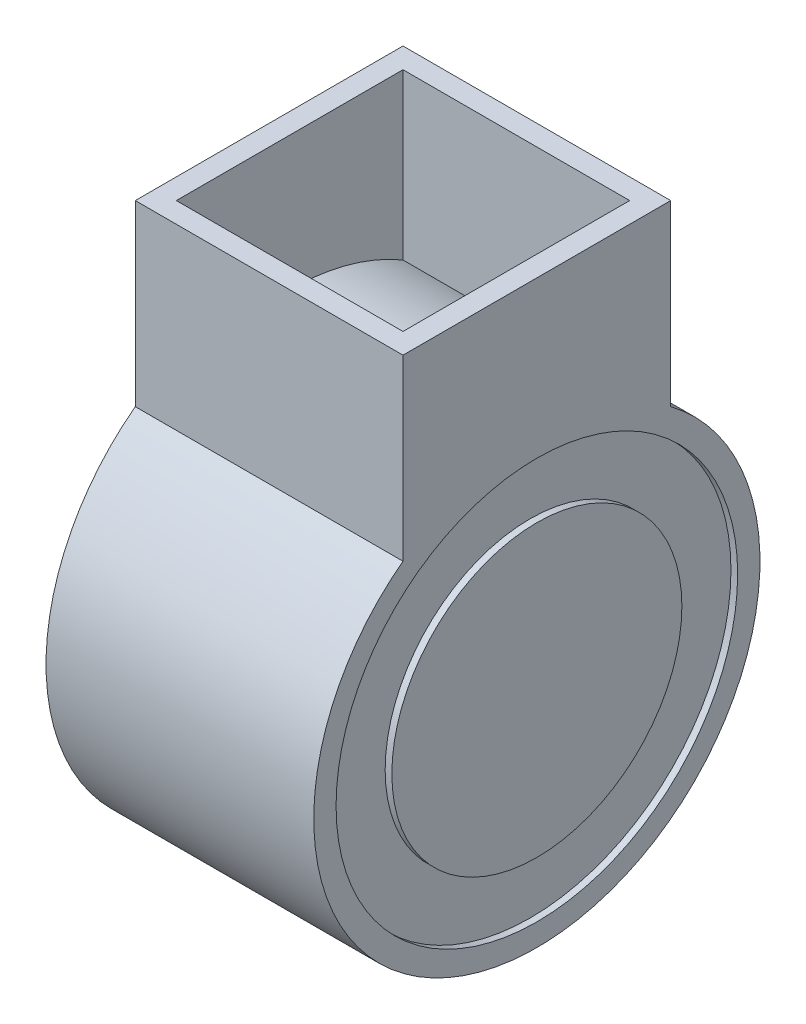
ISO-10303-21;
HEADER;
FILE_DESCRIPTION(('STEP AP214'),'2;1');
FILE_NAME('part.step','',(''),(''),'','','');
FILE_SCHEMA(('AUTOMOTIVE_DESIGN { 1 0 10303 214 1 1 1 1 }'));
ENDSEC;
DATA;
#1=APPLICATION_CONTEXT('core data for automotive mechanical design processes');
#2=APPLICATION_PROTOCOL_DEFINITION('international standard','automotive_design',2000,#1);
#3=PRODUCT_CONTEXT('',#1,'mechanical');
#4=PRODUCT('Part','Part','',(#3));
#5=PRODUCT_RELATED_PRODUCT_CATEGORY('part','',(#4));
#6=PRODUCT_DEFINITION_FORMATION('','',#4);
#7=PRODUCT_DEFINITION_CONTEXT('part definition',#1,'design');
#8=PRODUCT_DEFINITION('design','',#6,#7);
#9=PRODUCT_DEFINITION_SHAPE('','',#8);
#10=(LENGTH_UNIT() NAMED_UNIT(*) SI_UNIT(.MILLI.,.METRE.));
#11=(NAMED_UNIT(*) PLANE_ANGLE_UNIT() SI_UNIT($,.RADIAN.));
#12=(NAMED_UNIT(*) SI_UNIT($,.STERADIAN.) SOLID_ANGLE_UNIT());
#13=UNCERTAINTY_MEASURE_WITH_UNIT(LENGTH_MEASURE(1.E-05),#10,'distance_accuracy_value','');
#14=(GEOMETRIC_REPRESENTATION_CONTEXT(3) GLOBAL_UNCERTAINTY_ASSIGNED_CONTEXT((#13)) GLOBAL_UNIT_ASSIGNED_CONTEXT((#10,
#11,#12)) REPRESENTATION_CONTEXT('',''));
#15=CARTESIAN_POINT('',(0.,0.,0.));
#16=DIRECTION('',(0.,0.,1.));
#17=DIRECTION('',(1.,0.,0.));
#18=AXIS2_PLACEMENT_3D('',#15,#16,#17);
#19=CARTESIAN_POINT('',(30.,0.,0.));
#20=DIRECTION('',(-1.,0.,0.));
#21=DIRECTION('',(0.,0.,1.));
#22=AXIS2_PLACEMENT_3D('',#19,#20,#21);
#23=CYLINDRICAL_SURFACE('',#22,50.);
#24=DIRECTION('',(-1.,0.,0.));
#25=VECTOR('',#24,1.);
#26=CARTESIAN_POINT('',(30.,43.0678534408206,25.4));
#27=LINE('',#26,#25);
#28=CARTESIAN_POINT('',(-25.4,43.0678534408206,25.4));
#29=VERTEX_POINT('',#28);
#30=CARTESIAN_POINT('',(25.4,43.0678534408206,25.4));
#31=VERTEX_POINT('',#30);
#32=EDGE_CURVE('E78',#29,#31,#27,.F.);
#33=ORIENTED_EDGE('',*,*,#32,.T.);
#34=CARTESIAN_POINT('',(25.4,0.,0.));
#35=DIRECTION('',(1.,0.,0.));
#36=DIRECTION('',(0.,0.,-1.));
#37=AXIS2_PLACEMENT_3D('',#34,#35,#36);
#38=CIRCLE('',#37,50.);
#39=CARTESIAN_POINT('',(25.4,43.0678534408206,-25.4));
#40=VERTEX_POINT('',#39);
#41=EDGE_CURVE('E171',#31,#40,#38,.F.);
#42=ORIENTED_EDGE('',*,*,#41,.T.);
#43=DIRECTION('',(-1.,0.,0.));
#44=VECTOR('',#43,1.);
#45=CARTESIAN_POINT('',(30.,43.0678534408206,-25.4));
#46=LINE('',#45,#44);
#47=CARTESIAN_POINT('',(-25.4,43.0678534408206,-25.4));
#48=VERTEX_POINT('',#47);
#49=EDGE_CURVE('E167',#40,#48,#46,.T.);
#50=ORIENTED_EDGE('',*,*,#49,.T.);
#51=CARTESIAN_POINT('',(-25.4,0.,0.));
#52=DIRECTION('',(-1.,0.,0.));
#53=DIRECTION('',(0.,0.,1.));
#54=AXIS2_PLACEMENT_3D('',#51,#52,#53);
#55=CIRCLE('',#54,50.);
#56=EDGE_CURVE('E74',#48,#29,#55,.F.);
#57=ORIENTED_EDGE('',*,*,#56,.T.);
#58=EDGE_LOOP('',(#33,#42,#50,#57));
#59=FACE_BOUND('',#58,.T.);
#60=ADVANCED_FACE('F59',(#59),#23,.T.);
#61=CARTESIAN_POINT('',(-25.4,-50.002,25.4));
#62=DIRECTION('',(0.,0.,1.));
#63=DIRECTION('',(1.,0.,0.));
#64=AXIS2_PLACEMENT_3D('',#61,#62,#63);
#65=PLANE('',#64);
#66=ORIENTED_EDGE('',*,*,#32,.F.);
#67=DIRECTION('',(0.,1.,0.));
#68=VECTOR('',#67,1.);
#69=CARTESIAN_POINT('',(-25.4,-50.002,25.4));
#70=LINE('',#69,#68);
#71=CARTESIAN_POINT('',(-25.4,80.,25.4));
#72=VERTEX_POINT('',#71);
#73=EDGE_CURVE('E157',#29,#72,#70,.T.);
#74=ORIENTED_EDGE('',*,*,#73,.T.);
#75=DIRECTION('',(1.,0.,0.));
#76=VECTOR('',#75,1.);
#77=CARTESIAN_POINT('',(-25.4,80.,25.4));
#78=LINE('',#77,#76);
#79=CARTESIAN_POINT('',(25.4,80.,25.4));
#80=VERTEX_POINT('',#79);
#81=EDGE_CURVE('E278',#72,#80,#78,.T.);
#82=ORIENTED_EDGE('',*,*,#81,.T.);
#83=DIRECTION('',(0.,1.,0.));
#84=VECTOR('',#83,1.);
#85=CARTESIAN_POINT('',(25.4,-50.002,25.4));
#86=LINE('',#85,#84);
#87=EDGE_CURVE('E158',#31,#80,#86,.T.);
#88=ORIENTED_EDGE('',*,*,#87,.F.);
#89=EDGE_LOOP('',(#66,#74,#82,#88));
#90=FACE_BOUND('',#89,.T.);
#91=ADVANCED_FACE('F194',(#90),#65,.F.);
#92=CARTESIAN_POINT('',(-30.,-50.002,-30.));
#93=DIRECTION('',(0.,0.,-1.));
#94=DIRECTION('',(-1.,0.,0.));
#95=AXIS2_PLACEMENT_3D('',#92,#93,#94);
#96=PLANE('',#95);
#97=DIRECTION('',(0.,1.,0.));
#98=VECTOR('',#97,1.);
#99=CARTESIAN_POINT('',(30.,-50.002,-30.));
#100=LINE('',#99,#98);
#101=CARTESIAN_POINT('',(30.,40.,-30.));
#102=VERTEX_POINT('',#101);
#103=CARTESIAN_POINT('',(30.,80.,-30.));
#104=VERTEX_POINT('',#103);
#105=EDGE_CURVE('E132',#102,#104,#100,.T.);
#106=ORIENTED_EDGE('',*,*,#105,.F.);
#107=DIRECTION('',(-1.,0.,0.));
#108=VECTOR('',#107,1.);
#109=CARTESIAN_POINT('',(30.,40.,-30.));
#110=LINE('',#109,#108);
#111=CARTESIAN_POINT('',(-30.,40.,-30.));
#112=VERTEX_POINT('',#111);
#113=EDGE_CURVE('E130',#102,#112,#110,.T.);
#114=ORIENTED_EDGE('',*,*,#113,.T.);
#115=DIRECTION('',(0.,1.,0.));
#116=VECTOR('',#115,1.);
#117=CARTESIAN_POINT('',(-30.,-50.002,-30.));
#118=LINE('',#117,#116);
#119=CARTESIAN_POINT('',(-30.,80.,-30.));
#120=VERTEX_POINT('',#119);
#121=EDGE_CURVE('E123',#112,#120,#118,.T.);
#122=ORIENTED_EDGE('',*,*,#121,.T.);
#123=DIRECTION('',(-1.,0.,0.));
#124=VECTOR('',#123,1.);
#125=CARTESIAN_POINT('',(-30.,80.,-30.));
#126=LINE('',#125,#124);
#127=EDGE_CURVE('E128',#104,#120,#126,.T.);
#128=ORIENTED_EDGE('',*,*,#127,.F.);
#129=EDGE_LOOP('',(#106,#114,#122,#128));
#130=FACE_BOUND('',#129,.T.);
#131=ADVANCED_FACE('F126',(#130),#96,.T.);
#132=CARTESIAN_POINT('',(-25.4,-50.002,25.4));
#133=DIRECTION('',(-1.,0.,0.));
#134=DIRECTION('',(0.,0.,1.));
#135=AXIS2_PLACEMENT_3D('',#132,#133,#134);
#136=PLANE('',#135);
#137=ORIENTED_EDGE('',*,*,#56,.F.);
#138=DIRECTION('',(0.,1.,0.));
#139=VECTOR('',#138,1.);
#140=CARTESIAN_POINT('',(-25.4,-50.002,-25.4));
#141=LINE('',#140,#139);
#142=CARTESIAN_POINT('',(-25.4,80.,-25.4));
#143=VERTEX_POINT('',#142);
#144=EDGE_CURVE('E155',#48,#143,#141,.T.);
#145=ORIENTED_EDGE('',*,*,#144,.T.);
#146=DIRECTION('',(0.,0.,1.));
#147=VECTOR('',#146,1.);
#148=CARTESIAN_POINT('',(-25.4,80.,25.4));
#149=LINE('',#148,#147);
#150=EDGE_CURVE('E281',#143,#72,#149,.T.);
#151=ORIENTED_EDGE('',*,*,#150,.T.);
#152=ORIENTED_EDGE('',*,*,#73,.F.);
#153=EDGE_LOOP('',(#137,#145,#151,#152));
#154=FACE_BOUND('',#153,.T.);
#155=ADVANCED_FACE('F216',(#154),#136,.F.);
#156=CARTESIAN_POINT('',(0.,80.,0.));
#157=DIRECTION('',(0.,-1.,0.));
#158=DIRECTION('',(0.,0.,-1.));
#159=AXIS2_PLACEMENT_3D('',#156,#157,#158);
#160=PLANE('',#159);
#161=DIRECTION('',(0.,0.,-1.));
#162=VECTOR('',#161,1.);
#163=CARTESIAN_POINT('',(30.,80.,30.));
#164=LINE('',#163,#162);
#165=CARTESIAN_POINT('',(30.,80.,30.));
#166=VERTEX_POINT('',#165);
#167=EDGE_CURVE('E147',#166,#104,#164,.T.);
#168=ORIENTED_EDGE('',*,*,#167,.T.);
#169=ORIENTED_EDGE('',*,*,#127,.T.);
#170=DIRECTION('',(0.,0.,1.));
#171=VECTOR('',#170,1.);
#172=CARTESIAN_POINT('',(-30.,80.,30.));
#173=LINE('',#172,#171);
#174=CARTESIAN_POINT('',(-30.,80.,30.));
#175=VERTEX_POINT('',#174);
#176=EDGE_CURVE('E136',#120,#175,#173,.T.);
#177=ORIENTED_EDGE('',*,*,#176,.T.);
#178=DIRECTION('',(1.,0.,0.));
#179=VECTOR('',#178,1.);
#180=CARTESIAN_POINT('',(-30.,80.,30.));
#181=LINE('',#180,#179);
#182=EDGE_CURVE('E142',#175,#166,#181,.T.);
#183=ORIENTED_EDGE('',*,*,#182,.T.);
#184=EDGE_LOOP('',(#168,#169,#177,#183));
#185=FACE_BOUND('',#184,.T.);
#186=DIRECTION('',(0.,0.,-1.));
#187=VECTOR('',#186,1.);
#188=CARTESIAN_POINT('',(25.4,80.,25.4));
#189=LINE('',#188,#187);
#190=CARTESIAN_POINT('',(25.4,80.,-25.4));
#191=VERTEX_POINT('',#190);
#192=EDGE_CURVE('E164',#80,#191,#189,.T.);
#193=ORIENTED_EDGE('',*,*,#192,.F.);
#194=ORIENTED_EDGE('',*,*,#81,.F.);
#195=ORIENTED_EDGE('',*,*,#150,.F.);
#196=DIRECTION('',(-1.,0.,0.));
#197=VECTOR('',#196,1.);
#198=CARTESIAN_POINT('',(-25.4,80.,-25.4));
#199=LINE('',#198,#197);
#200=EDGE_CURVE('E284',#191,#143,#199,.T.);
#201=ORIENTED_EDGE('',*,*,#200,.F.);
#202=EDGE_LOOP('',(#193,#194,#195,#201));
#203=FACE_BOUND('',#202,.T.);
#204=ADVANCED_FACE('F144',(#185,#203),#160,.F.);
#205=CARTESIAN_POINT('',(25.4,-50.002,25.4));
#206=DIRECTION('',(1.,0.,0.));
#207=DIRECTION('',(0.,0.,-1.));
#208=AXIS2_PLACEMENT_3D('',#205,#206,#207);
#209=PLANE('',#208);
#210=ORIENTED_EDGE('',*,*,#41,.F.);
#211=ORIENTED_EDGE('',*,*,#87,.T.);
#212=ORIENTED_EDGE('',*,*,#192,.T.);
#213=DIRECTION('',(0.,1.,0.));
#214=VECTOR('',#213,1.);
#215=CARTESIAN_POINT('',(25.4,-50.002,-25.4));
#216=LINE('',#215,#214);
#217=EDGE_CURVE('E153',#40,#191,#216,.T.);
#218=ORIENTED_EDGE('',*,*,#217,.F.);
#219=EDGE_LOOP('',(#210,#211,#212,#218));
#220=FACE_BOUND('',#219,.T.);
#221=ADVANCED_FACE('F210',(#220),#209,.F.);
#222=CARTESIAN_POINT('',(-25.4,-50.002,-25.4));
#223=DIRECTION('',(0.,0.,-1.));
#224=DIRECTION('',(-1.,0.,0.));
#225=AXIS2_PLACEMENT_3D('',#222,#223,#224);
#226=PLANE('',#225);
#227=ORIENTED_EDGE('',*,*,#49,.F.);
#228=ORIENTED_EDGE('',*,*,#217,.T.);
#229=ORIENTED_EDGE('',*,*,#200,.T.);
#230=ORIENTED_EDGE('',*,*,#144,.F.);
#231=EDGE_LOOP('',(#227,#228,#229,#230));
#232=FACE_BOUND('',#231,.T.);
#233=ADVANCED_FACE('F201',(#232),#226,.F.);
#234=CARTESIAN_POINT('',(-30.,-50.002,30.));
#235=DIRECTION('',(0.,0.,1.));
#236=DIRECTION('',(1.,0.,0.));
#237=AXIS2_PLACEMENT_3D('',#234,#235,#236);
#238=PLANE('',#237);
#239=DIRECTION('',(0.,1.,0.));
#240=VECTOR('',#239,1.);
#241=CARTESIAN_POINT('',(-30.,-50.002,30.));
#242=LINE('',#241,#240);
#243=CARTESIAN_POINT('',(-30.,40.,30.));
#244=VERTEX_POINT('',#243);
#245=EDGE_CURVE('E133',#244,#175,#242,.T.);
#246=ORIENTED_EDGE('',*,*,#245,.F.);
#247=DIRECTION('',(-1.,0.,0.));
#248=VECTOR('',#247,1.);
#249=CARTESIAN_POINT('',(30.,40.,30.));
#250=LINE('',#249,#248);
#251=CARTESIAN_POINT('',(30.,40.,30.));
#252=VERTEX_POINT('',#251);
#253=EDGE_CURVE('E160',#244,#252,#250,.F.);
#254=ORIENTED_EDGE('',*,*,#253,.T.);
#255=DIRECTION('',(0.,1.,0.));
#256=VECTOR('',#255,1.);
#257=CARTESIAN_POINT('',(30.,-50.002,30.));
#258=LINE('',#257,#256);
#259=EDGE_CURVE('E162',#252,#166,#258,.T.);
#260=ORIENTED_EDGE('',*,*,#259,.T.);
#261=ORIENTED_EDGE('',*,*,#182,.F.);
#262=EDGE_LOOP('',(#246,#254,#260,#261));
#263=FACE_BOUND('',#262,.T.);
#264=ADVANCED_FACE('F178',(#263),#238,.T.);
#265=CARTESIAN_POINT('',(30.,0.,0.));
#266=DIRECTION('',(1.,0.,0.));
#267=DIRECTION('',(0.,0.,-1.));
#268=AXIS2_PLACEMENT_3D('',#265,#266,#267);
#269=PLANE('',#268);
#270=CARTESIAN_POINT('',(30.,0.,0.));
#271=DIRECTION('',(1.,0.,0.));
#272=DIRECTION('',(0.,0.,-1.));
#273=AXIS2_PLACEMENT_3D('',#270,#271,#272);
#274=CIRCLE('',#273,45.);
#275=CARTESIAN_POINT('',(30.,0.,-45.));
#276=VERTEX_POINT('',#275);
#277=EDGE_CURVE('E271',#276,#276,#274,.T.);
#278=ORIENTED_EDGE('',*,*,#277,.F.);
#279=EDGE_LOOP('',(#278));
#280=FACE_BOUND('',#279,.T.);
#281=CARTESIAN_POINT('',(30.,0.,0.));
#282=DIRECTION('',(1.,0.,0.));
#283=DIRECTION('',(0.,0.,-1.));
#284=AXIS2_PLACEMENT_3D('',#281,#282,#283);
#285=CIRCLE('',#284,50.);
#286=EDGE_CURVE('E12',#252,#102,#285,.T.);
#287=ORIENTED_EDGE('',*,*,#286,.T.);
#288=ORIENTED_EDGE('',*,*,#105,.T.);
#289=ORIENTED_EDGE('',*,*,#167,.F.);
#290=ORIENTED_EDGE('',*,*,#259,.F.);
#291=EDGE_LOOP('',(#287,#288,#289,#290));
#292=FACE_BOUND('',#291,.T.);
#293=ADVANCED_FACE('F181',(#280,#292),#269,.T.);
#294=CARTESIAN_POINT('',(-30.,0.,0.));
#295=DIRECTION('',(1.,0.,0.));
#296=DIRECTION('',(0.,0.,-1.));
#297=AXIS2_PLACEMENT_3D('',#294,#295,#296);
#298=PLANE('',#297);
#299=CARTESIAN_POINT('',(-30.,0.,0.));
#300=DIRECTION('',(1.,0.,0.));
#301=DIRECTION('',(0.,0.,-1.));
#302=AXIS2_PLACEMENT_3D('',#299,#300,#301);
#303=CIRCLE('',#302,45.);
#304=CARTESIAN_POINT('',(-30.,0.,-45.));
#305=VERTEX_POINT('',#304);
#306=EDGE_CURVE('E259',#305,#305,#303,.T.);
#307=ORIENTED_EDGE('',*,*,#306,.T.);
#308=EDGE_LOOP('',(#307));
#309=FACE_BOUND('',#308,.T.);
#310=CARTESIAN_POINT('',(-30.,0.,0.));
#311=DIRECTION('',(1.,0.,0.));
#312=DIRECTION('',(0.,0.,-1.));
#313=AXIS2_PLACEMENT_3D('',#310,#311,#312);
#314=CIRCLE('',#313,50.);
#315=EDGE_CURVE('E63',#244,#112,#314,.T.);
#316=ORIENTED_EDGE('',*,*,#315,.F.);
#317=ORIENTED_EDGE('',*,*,#245,.T.);
#318=ORIENTED_EDGE('',*,*,#176,.F.);
#319=ORIENTED_EDGE('',*,*,#121,.F.);
#320=EDGE_LOOP('',(#316,#317,#318,#319));
#321=FACE_BOUND('',#320,.T.);
#322=ADVANCED_FACE('F137',(#309,#321),#298,.F.);
#323=ORIENTED_EDGE('',*,*,#315,.T.);
#324=ORIENTED_EDGE('',*,*,#113,.F.);
#325=ORIENTED_EDGE('',*,*,#286,.F.);
#326=ORIENTED_EDGE('',*,*,#253,.F.);
#327=EDGE_LOOP('',(#323,#324,#325,#326));
#328=FACE_BOUND('',#327,.T.);
#329=ADVANCED_FACE('F61',(#328),#23,.T.);
#330=CARTESIAN_POINT('',(28.5,0.,0.));
#331=DIRECTION('',(1.,0.,0.));
#332=DIRECTION('',(0.,0.,-1.));
#333=AXIS2_PLACEMENT_3D('',#330,#331,#332);
#334=CYLINDRICAL_SURFACE('',#333,45.);
#335=CARTESIAN_POINT('',(28.5,0.,0.));
#336=DIRECTION('',(1.,0.,0.));
#337=DIRECTION('',(0.,0.,-1.));
#338=AXIS2_PLACEMENT_3D('',#335,#336,#337);
#339=CIRCLE('',#338,45.);
#340=CARTESIAN_POINT('',(28.5,0.,-45.));
#341=VERTEX_POINT('',#340);
#342=EDGE_CURVE('E149',#341,#341,#339,.T.);
#343=ORIENTED_EDGE('',*,*,#342,.F.);
#344=EDGE_LOOP('',(#343));
#345=FACE_BOUND('',#344,.T.);
#346=ORIENTED_EDGE('',*,*,#277,.T.);
#347=EDGE_LOOP('',(#346));
#348=FACE_BOUND('',#347,.T.);
#349=ADVANCED_FACE('F183',(#345,#348),#334,.F.);
#350=CARTESIAN_POINT('',(28.5,0.,0.));
#351=DIRECTION('',(1.,0.,0.));
#352=DIRECTION('',(0.,0.,-1.));
#353=AXIS2_PLACEMENT_3D('',#350,#351,#352);
#354=PLANE('',#353);
#355=CARTESIAN_POINT('',(28.5,0.,0.));
#356=DIRECTION('',(1.,0.,0.));
#357=DIRECTION('',(0.,0.,-1.));
#358=AXIS2_PLACEMENT_3D('',#355,#356,#357);
#359=CIRCLE('',#358,32.5);
#360=CARTESIAN_POINT('',(28.5,0.,-32.5));
#361=VERTEX_POINT('',#360);
#362=EDGE_CURVE('E268',#361,#361,#359,.T.);
#363=ORIENTED_EDGE('',*,*,#362,.F.);
#364=EDGE_LOOP('',(#363));
#365=FACE_BOUND('',#364,.T.);
#366=ORIENTED_EDGE('',*,*,#342,.T.);
#367=EDGE_LOOP('',(#366));
#368=FACE_BOUND('',#367,.T.);
#369=ADVANCED_FACE('F188',(#365,#368),#354,.T.);
#370=CARTESIAN_POINT('',(28.5,0.,0.));
#371=DIRECTION('',(1.,0.,0.));
#372=DIRECTION('',(0.,0.,-1.));
#373=AXIS2_PLACEMENT_3D('',#370,#371,#372);
#374=CYLINDRICAL_SURFACE('',#373,32.5);
#375=ORIENTED_EDGE('',*,*,#362,.T.);
#376=EDGE_LOOP('',(#375));
#377=FACE_BOUND('',#376,.T.);
#378=CARTESIAN_POINT('',(30.,0.,0.));
#379=DIRECTION('',(1.,0.,0.));
#380=DIRECTION('',(0.,0.,-1.));
#381=AXIS2_PLACEMENT_3D('',#378,#379,#380);
#382=CIRCLE('',#381,32.5);
#383=CARTESIAN_POINT('',(30.,0.,-32.5));
#384=VERTEX_POINT('',#383);
#385=EDGE_CURVE('E265',#384,#384,#382,.T.);
#386=ORIENTED_EDGE('',*,*,#385,.F.);
#387=EDGE_LOOP('',(#386));
#388=FACE_BOUND('',#387,.T.);
#389=ADVANCED_FACE('F231',(#377,#388),#374,.T.);
#390=ORIENTED_EDGE('',*,*,#385,.T.);
#391=EDGE_LOOP('',(#390));
#392=FACE_BOUND('',#391,.T.);
#393=ADVANCED_FACE('F209',(#392),#269,.T.);
#394=CARTESIAN_POINT('',(-28.5,0.,0.));
#395=DIRECTION('',(-1.,0.,0.));
#396=DIRECTION('',(0.,0.,-1.));
#397=AXIS2_PLACEMENT_3D('',#394,#395,#396);
#398=PLANE('',#397);
#399=CARTESIAN_POINT('',(-28.5,0.,0.));
#400=DIRECTION('',(1.,0.,0.));
#401=DIRECTION('',(0.,0.,-1.));
#402=AXIS2_PLACEMENT_3D('',#399,#400,#401);
#403=CIRCLE('',#402,45.);
#404=CARTESIAN_POINT('',(-28.5,0.,-45.));
#405=VERTEX_POINT('',#404);
#406=EDGE_CURVE('E262',#405,#405,#403,.T.);
#407=ORIENTED_EDGE('',*,*,#406,.F.);
#408=EDGE_LOOP('',(#407));
#409=FACE_BOUND('',#408,.T.);
#410=CARTESIAN_POINT('',(-28.5,0.,0.));
#411=DIRECTION('',(1.,0.,0.));
#412=DIRECTION('',(0.,0.,-1.));
#413=AXIS2_PLACEMENT_3D('',#410,#411,#412);
#414=CIRCLE('',#413,32.5);
#415=CARTESIAN_POINT('',(-28.5,0.,-32.5));
#416=VERTEX_POINT('',#415);
#417=EDGE_CURVE('E254',#416,#416,#414,.T.);
#418=ORIENTED_EDGE('',*,*,#417,.T.);
#419=EDGE_LOOP('',(#418));
#420=FACE_BOUND('',#419,.T.);
#421=ADVANCED_FACE('F240',(#409,#420),#398,.T.);
#422=CARTESIAN_POINT('',(-28.5,0.,0.));
#423=DIRECTION('',(-1.,0.,0.));
#424=DIRECTION('',(0.,0.,1.));
#425=AXIS2_PLACEMENT_3D('',#422,#423,#424);
#426=CYLINDRICAL_SURFACE('',#425,45.);
#427=ORIENTED_EDGE('',*,*,#406,.T.);
#428=EDGE_LOOP('',(#427));
#429=FACE_BOUND('',#428,.T.);
#430=ORIENTED_EDGE('',*,*,#306,.F.);
#431=EDGE_LOOP('',(#430));
#432=FACE_BOUND('',#431,.T.);
#433=ADVANCED_FACE('F236',(#429,#432),#426,.F.);
#434=CARTESIAN_POINT('',(-28.5,0.,0.));
#435=DIRECTION('',(-1.,0.,0.));
#436=DIRECTION('',(0.,0.,1.));
#437=AXIS2_PLACEMENT_3D('',#434,#435,#436);
#438=CYLINDRICAL_SURFACE('',#437,32.5);
#439=ORIENTED_EDGE('',*,*,#417,.F.);
#440=EDGE_LOOP('',(#439));
#441=FACE_BOUND('',#440,.T.);
#442=CARTESIAN_POINT('',(-30.,0.,0.));
#443=DIRECTION('',(1.,0.,0.));
#444=DIRECTION('',(0.,0.,-1.));
#445=AXIS2_PLACEMENT_3D('',#442,#443,#444);
#446=CIRCLE('',#445,32.5);
#447=CARTESIAN_POINT('',(-30.,0.,-32.5));
#448=VERTEX_POINT('',#447);
#449=EDGE_CURVE('E257',#448,#448,#446,.T.);
#450=ORIENTED_EDGE('',*,*,#449,.T.);
#451=EDGE_LOOP('',(#450));
#452=FACE_BOUND('',#451,.T.);
#453=ADVANCED_FACE('F239',(#441,#452),#438,.T.);
#454=ORIENTED_EDGE('',*,*,#449,.F.);
#455=EDGE_LOOP('',(#454));
#456=FACE_BOUND('',#455,.T.);
#457=ADVANCED_FACE('F192',(#456),#298,.F.);
#458=CLOSED_SHELL('',(#60,#91,#131,#155,#204,#221,#233,#264,#293,#322,#329,#349,#369,#389,#393,
#421,#433,#453,#457));
#459=MANIFOLD_SOLID_BREP('B2',#458);
#460=ADVANCED_BREP_SHAPE_REPRESENTATION('',(#18,#459),#14);
#461=SHAPE_DEFINITION_REPRESENTATION(#9,#460);
ENDSEC;
END-ISO-10303-21;
